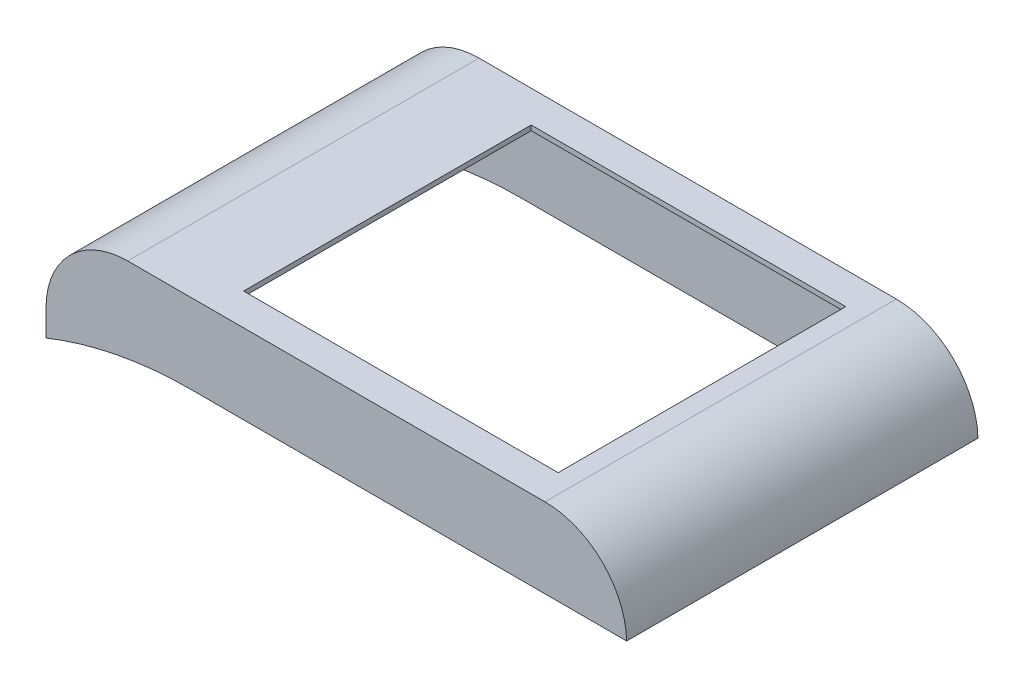
ISO-10303-21;
HEADER;
FILE_DESCRIPTION(('STEP AP214'),'2;1');
FILE_NAME('part.step','',(''),(''),'','','');
FILE_SCHEMA(('AUTOMOTIVE_DESIGN { 1 0 10303 214 1 1 1 1 }'));
ENDSEC;
DATA;
#1=APPLICATION_CONTEXT('core data for automotive mechanical design processes');
#2=APPLICATION_PROTOCOL_DEFINITION('international standard','automotive_design',2000,#1);
#3=PRODUCT_CONTEXT('',#1,'mechanical');
#4=PRODUCT('Part','Part','',(#3));
#5=PRODUCT_RELATED_PRODUCT_CATEGORY('part','',(#4));
#6=PRODUCT_DEFINITION_FORMATION('','',#4);
#7=PRODUCT_DEFINITION_CONTEXT('part definition',#1,'design');
#8=PRODUCT_DEFINITION('design','',#6,#7);
#9=PRODUCT_DEFINITION_SHAPE('','',#8);
#10=(LENGTH_UNIT() NAMED_UNIT(*) SI_UNIT(.MILLI.,.METRE.));
#11=(NAMED_UNIT(*) PLANE_ANGLE_UNIT() SI_UNIT($,.RADIAN.));
#12=(NAMED_UNIT(*) SI_UNIT($,.STERADIAN.) SOLID_ANGLE_UNIT());
#13=UNCERTAINTY_MEASURE_WITH_UNIT(LENGTH_MEASURE(1.E-05),#10,'distance_accuracy_value','');
#14=(GEOMETRIC_REPRESENTATION_CONTEXT(3) GLOBAL_UNCERTAINTY_ASSIGNED_CONTEXT((#13)) GLOBAL_UNIT_ASSIGNED_CONTEXT((#10,
#11,#12)) REPRESENTATION_CONTEXT('',''));
#15=CARTESIAN_POINT('',(0.,0.,0.));
#16=DIRECTION('',(0.,0.,1.));
#17=DIRECTION('',(1.,0.,0.));
#18=AXIS2_PLACEMENT_3D('',#15,#16,#17);
#19=CARTESIAN_POINT('',(18.57473769217,-76.2184026334848,-19.));
#20=DIRECTION('',(0.,0.,-1.));
#21=DIRECTION('',(-1.,0.,0.));
#22=AXIS2_PLACEMENT_3D('',#19,#20,#21);
#23=PLANE('',#22);
#24=DIRECTION('',(-1.,0.,0.));
#25=VECTOR('',#24,1.);
#26=CARTESIAN_POINT('',(18.57473769217,0.,-19.));
#27=LINE('',#26,#25);
#28=CARTESIAN_POINT('',(3.57473769217,0.,-19.));
#29=VERTEX_POINT('',#28);
#30=CARTESIAN_POINT('',(-32.2823525408233,0.,-19.));
#31=VERTEX_POINT('',#30);
#32=EDGE_CURVE('E284',#29,#31,#27,.T.);
#33=ORIENTED_EDGE('',*,*,#32,.F.);
#34=DIRECTION('',(0.,-1.,0.));
#35=VECTOR('',#34,1.);
#36=CARTESIAN_POINT('',(3.57473769217,3.,-19.));
#37=LINE('',#36,#35);
#38=CARTESIAN_POINT('',(3.57473769217,3.,-19.));
#39=VERTEX_POINT('',#38);
#40=EDGE_CURVE('E192',#39,#29,#37,.T.);
#41=ORIENTED_EDGE('',*,*,#40,.F.);
#42=DIRECTION('',(1.,0.,0.));
#43=VECTOR('',#42,1.);
#44=CARTESIAN_POINT('',(18.57473769217,3.,-19.));
#45=LINE('',#44,#43);
#46=CARTESIAN_POINT('',(18.4229126315243,3.,-19.));
#47=VERTEX_POINT('',#46);
#48=EDGE_CURVE('E193',#39,#47,#45,.T.);
#49=ORIENTED_EDGE('',*,*,#48,.T.);
#50=CARTESIAN_POINT('',(11.57473769217,1.55,-19.));
#51=DIRECTION('',(0.,0.,-1.));
#52=DIRECTION('',(-1.,0.,0.));
#53=AXIS2_PLACEMENT_3D('',#50,#51,#52);
#54=CIRCLE('',#53,7.);
#55=CARTESIAN_POINT('',(11.57473769217,8.55,-19.));
#56=VERTEX_POINT('',#55);
#57=EDGE_CURVE('E336',#47,#56,#54,.F.);
#58=ORIENTED_EDGE('',*,*,#57,.T.);
#59=DIRECTION('',(-1.,0.,0.));
#60=VECTOR('',#59,1.);
#61=CARTESIAN_POINT('',(18.57473769217,8.55,-19.));
#62=LINE('',#61,#60);
#63=CARTESIAN_POINT('',(-40.49526230783,8.55,-19.));
#64=VERTEX_POINT('',#63);
#65=EDGE_CURVE('E275',#56,#64,#62,.T.);
#66=ORIENTED_EDGE('',*,*,#65,.T.);
#67=CARTESIAN_POINT('',(-40.49526230783,1.55,-19.));
#68=DIRECTION('',(0.,0.,-1.));
#69=DIRECTION('',(-1.,0.,0.));
#70=AXIS2_PLACEMENT_3D('',#67,#68,#69);
#71=CIRCLE('',#70,7.);
#72=CARTESIAN_POINT('',(-47.49526230783,1.54999999999997,-19.));
#73=VERTEX_POINT('',#72);
#74=EDGE_CURVE('E338',#64,#73,#71,.F.);
#75=ORIENTED_EDGE('',*,*,#74,.T.);
#76=DIRECTION('',(0.,1.,0.));
#77=VECTOR('',#76,1.);
#78=CARTESIAN_POINT('',(-47.49526230783,-76.2184026334848,-19.));
#79=LINE('',#78,#77);
#80=CARTESIAN_POINT('',(-47.49526230783,-2.49640650628476,-19.));
#81=VERTEX_POINT('',#80);
#82=EDGE_CURVE('E288',#81,#73,#79,.T.);
#83=ORIENTED_EDGE('',*,*,#82,.F.);
#84=CARTESIAN_POINT('',(-32.2823525408233,-47.60135587401,-19.));
#85=DIRECTION('',(0.,0.,-1.));
#86=DIRECTION('',(-1.,0.,0.));
#87=AXIS2_PLACEMENT_3D('',#84,#85,#86);
#88=CIRCLE('',#87,47.60135587401);
#89=EDGE_CURVE('E212',#81,#31,#88,.T.);
#90=ORIENTED_EDGE('',*,*,#89,.T.);
#91=EDGE_LOOP('',(#33,#41,#49,#58,#66,#75,#83,#90));
#92=FACE_BOUND('',#91,.T.);
#93=ADVANCED_FACE('F35',(#92),#23,.F.);
#94=CARTESIAN_POINT('',(-47.49526230783,-76.2184026334848,19.));
#95=DIRECTION('',(0.,0.,1.));
#96=DIRECTION('',(1.,0.,0.));
#97=AXIS2_PLACEMENT_3D('',#94,#95,#96);
#98=PLANE('',#97);
#99=DIRECTION('',(-1.,0.,0.));
#100=VECTOR('',#99,1.);
#101=CARTESIAN_POINT('',(18.57473769217,3.,19.));
#102=LINE('',#101,#100);
#103=CARTESIAN_POINT('',(18.4229126315243,3.,19.));
#104=VERTEX_POINT('',#103);
#105=CARTESIAN_POINT('',(3.57473769217,3.,19.));
#106=VERTEX_POINT('',#105);
#107=EDGE_CURVE('E50',#104,#106,#102,.T.);
#108=ORIENTED_EDGE('',*,*,#107,.T.);
#109=DIRECTION('',(0.,-1.,0.));
#110=VECTOR('',#109,1.);
#111=CARTESIAN_POINT('',(3.57473769217,3.,19.));
#112=LINE('',#111,#110);
#113=CARTESIAN_POINT('',(3.57473769217,0.,19.));
#114=VERTEX_POINT('',#113);
#115=EDGE_CURVE('E183',#106,#114,#112,.T.);
#116=ORIENTED_EDGE('',*,*,#115,.T.);
#117=DIRECTION('',(1.,0.,0.));
#118=VECTOR('',#117,1.);
#119=CARTESIAN_POINT('',(-47.49526230783,0.,19.));
#120=LINE('',#119,#118);
#121=CARTESIAN_POINT('',(-32.2823525408233,0.,19.));
#122=VERTEX_POINT('',#121);
#123=EDGE_CURVE('E289',#122,#114,#120,.T.);
#124=ORIENTED_EDGE('',*,*,#123,.F.);
#125=CARTESIAN_POINT('',(-32.2823525408233,-47.60135587401,19.));
#126=DIRECTION('',(0.,0.,1.));
#127=DIRECTION('',(1.,0.,0.));
#128=AXIS2_PLACEMENT_3D('',#125,#126,#127);
#129=CIRCLE('',#128,47.60135587401);
#130=CARTESIAN_POINT('',(-47.49526230783,-2.49640650628476,19.));
#131=VERTEX_POINT('',#130);
#132=EDGE_CURVE('E215',#122,#131,#129,.T.);
#133=ORIENTED_EDGE('',*,*,#132,.T.);
#134=DIRECTION('',(0.,1.,0.));
#135=VECTOR('',#134,1.);
#136=CARTESIAN_POINT('',(-47.49526230783,-76.2184026334848,19.));
#137=LINE('',#136,#135);
#138=CARTESIAN_POINT('',(-47.49526230783,1.54999999999997,19.));
#139=VERTEX_POINT('',#138);
#140=EDGE_CURVE('E292',#131,#139,#137,.T.);
#141=ORIENTED_EDGE('',*,*,#140,.T.);
#142=CARTESIAN_POINT('',(-40.49526230783,1.55,19.));
#143=DIRECTION('',(0.,0.,1.));
#144=DIRECTION('',(1.,0.,0.));
#145=AXIS2_PLACEMENT_3D('',#142,#143,#144);
#146=CIRCLE('',#145,7.);
#147=CARTESIAN_POINT('',(-40.49526230783,8.55,19.));
#148=VERTEX_POINT('',#147);
#149=EDGE_CURVE('E330',#139,#148,#146,.F.);
#150=ORIENTED_EDGE('',*,*,#149,.T.);
#151=DIRECTION('',(1.,0.,0.));
#152=VECTOR('',#151,1.);
#153=CARTESIAN_POINT('',(-47.49526230783,8.55,19.));
#154=LINE('',#153,#152);
#155=CARTESIAN_POINT('',(11.57473769217,8.55,19.));
#156=VERTEX_POINT('',#155);
#157=EDGE_CURVE('E282',#148,#156,#154,.T.);
#158=ORIENTED_EDGE('',*,*,#157,.T.);
#159=CARTESIAN_POINT('',(11.57473769217,1.55,19.));
#160=DIRECTION('',(0.,0.,1.));
#161=DIRECTION('',(1.,0.,0.));
#162=AXIS2_PLACEMENT_3D('',#159,#160,#161);
#163=CIRCLE('',#162,7.);
#164=EDGE_CURVE('E203',#156,#104,#163,.F.);
#165=ORIENTED_EDGE('',*,*,#164,.T.);
#166=EDGE_LOOP('',(#108,#116,#124,#133,#141,#150,#158,#165));
#167=FACE_BOUND('',#166,.T.);
#168=ADVANCED_FACE('F200',(#167),#98,.F.);
#169=CARTESIAN_POINT('',(-32.2823525408233,0.,-21.5));
#170=DIRECTION('',(0.,-1.,0.));
#171=DIRECTION('',(1.,0.,0.));
#172=AXIS2_PLACEMENT_3D('',#169,#170,#171);
#173=PLANE('',#172);
#174=DIRECTION('',(0.,0.,-1.));
#175=VECTOR('',#174,1.);
#176=CARTESIAN_POINT('',(3.57473769217,0.,19.));
#177=LINE('',#176,#175);
#178=EDGE_CURVE('E188',#114,#29,#177,.T.);
#179=ORIENTED_EDGE('',*,*,#178,.T.);
#180=ORIENTED_EDGE('',*,*,#32,.T.);
#181=DIRECTION('',(0.,0.,1.));
#182=VECTOR('',#181,1.);
#183=CARTESIAN_POINT('',(-32.2823525408233,0.,-21.5));
#184=LINE('',#183,#182);
#185=CARTESIAN_POINT('',(-32.2823525408233,0.,-21.5));
#186=VERTEX_POINT('',#185);
#187=EDGE_CURVE('E317',#186,#31,#184,.T.);
#188=ORIENTED_EDGE('',*,*,#187,.F.);
#189=DIRECTION('',(1.,0.,0.));
#190=VECTOR('',#189,1.);
#191=CARTESIAN_POINT('',(-32.2823525408233,0.,-21.5));
#192=LINE('',#191,#190);
#193=CARTESIAN_POINT('',(21.0747376921568,0.,-21.5));
#194=VERTEX_POINT('',#193);
#195=EDGE_CURVE('E295',#186,#194,#192,.T.);
#196=ORIENTED_EDGE('',*,*,#195,.T.);
#197=DIRECTION('',(0.,0.,1.));
#198=VECTOR('',#197,1.);
#199=CARTESIAN_POINT('',(21.0747376921568,0.,-21.5));
#200=LINE('',#199,#198);
#201=CARTESIAN_POINT('',(21.0747376921568,0.,21.5));
#202=VERTEX_POINT('',#201);
#203=EDGE_CURVE('E307',#194,#202,#200,.T.);
#204=ORIENTED_EDGE('',*,*,#203,.T.);
#205=DIRECTION('',(1.,0.,0.));
#206=VECTOR('',#205,1.);
#207=CARTESIAN_POINT('',(-32.2823525408233,0.,21.5));
#208=LINE('',#207,#206);
#209=CARTESIAN_POINT('',(-32.2823525408233,0.,21.5));
#210=VERTEX_POINT('',#209);
#211=EDGE_CURVE('E291',#210,#202,#208,.T.);
#212=ORIENTED_EDGE('',*,*,#211,.F.);
#213=EDGE_CURVE('E321',#122,#210,#184,.T.);
#214=ORIENTED_EDGE('',*,*,#213,.F.);
#215=ORIENTED_EDGE('',*,*,#123,.T.);
#216=EDGE_LOOP('',(#179,#180,#188,#196,#204,#212,#214,#215));
#217=FACE_BOUND('',#216,.T.);
#218=ADVANCED_FACE('F363',(#217),#173,.T.);
#219=CARTESIAN_POINT('',(-32.2823525408233,-47.60135587401,-21.5));
#220=DIRECTION('',(0.,0.,1.));
#221=DIRECTION('',(1.,0.,0.));
#222=AXIS2_PLACEMENT_3D('',#219,#220,#221);
#223=CYLINDRICAL_SURFACE('',#222,47.60135587401);
#224=ORIENTED_EDGE('',*,*,#89,.F.);
#225=DIRECTION('',(0.,0.,1.));
#226=VECTOR('',#225,1.);
#227=CARTESIAN_POINT('',(-47.49526230783,-2.49640650628476,-21.5));
#228=LINE('',#227,#226);
#229=EDGE_CURVE('E208',#81,#131,#228,.T.);
#230=ORIENTED_EDGE('',*,*,#229,.T.);
#231=ORIENTED_EDGE('',*,*,#132,.F.);
#232=ORIENTED_EDGE('',*,*,#213,.T.);
#233=CARTESIAN_POINT('',(-32.2823525408233,-47.60135587401,21.5));
#234=DIRECTION('',(0.,0.,-1.));
#235=DIRECTION('',(-1.,0.,0.));
#236=AXIS2_PLACEMENT_3D('',#233,#234,#235);
#237=CIRCLE('',#236,47.60135587401);
#238=CARTESIAN_POINT('',(-49.99526230783,-3.418305858987,21.5));
#239=VERTEX_POINT('',#238);
#240=EDGE_CURVE('E299',#239,#210,#237,.T.);
#241=ORIENTED_EDGE('',*,*,#240,.F.);
#242=DIRECTION('',(0.,0.,1.));
#243=VECTOR('',#242,1.);
#244=CARTESIAN_POINT('',(-49.99526230783,-3.418305858987,-21.5));
#245=LINE('',#244,#243);
#246=CARTESIAN_POINT('',(-49.99526230783,-3.418305858987,-21.5));
#247=VERTEX_POINT('',#246);
#248=EDGE_CURVE('E322',#247,#239,#245,.T.);
#249=ORIENTED_EDGE('',*,*,#248,.F.);
#250=CARTESIAN_POINT('',(-32.2823525408233,-47.60135587401,-21.5));
#251=DIRECTION('',(0.,0.,-1.));
#252=DIRECTION('',(-1.,0.,0.));
#253=AXIS2_PLACEMENT_3D('',#250,#251,#252);
#254=CIRCLE('',#253,47.60135587401);
#255=EDGE_CURVE('E304',#247,#186,#254,.T.);
#256=ORIENTED_EDGE('',*,*,#255,.T.);
#257=ORIENTED_EDGE('',*,*,#187,.T.);
#258=EDGE_LOOP('',(#224,#230,#231,#232,#241,#249,#256,#257));
#259=FACE_BOUND('',#258,.T.);
#260=ADVANCED_FACE('F378',(#259),#223,.F.);
#261=CARTESIAN_POINT('',(-49.99526230783,9.75,-21.5));
#262=DIRECTION('',(-1.,0.,0.));
#263=DIRECTION('',(0.,-1.,0.));
#264=AXIS2_PLACEMENT_3D('',#261,#262,#263);
#265=PLANE('',#264);
#266=DIRECTION('',(0.,-1.,0.));
#267=VECTOR('',#266,1.);
#268=CARTESIAN_POINT('',(-49.99526230783,9.75,21.5));
#269=LINE('',#268,#267);
#270=CARTESIAN_POINT('',(-49.99526230783,-0.249999999999992,21.5));
#271=VERTEX_POINT('',#270);
#272=EDGE_CURVE('E313',#271,#239,#269,.T.);
#273=ORIENTED_EDGE('',*,*,#272,.F.);
#274=DIRECTION('',(0.,0.,1.));
#275=VECTOR('',#274,1.);
#276=CARTESIAN_POINT('',(-49.99526230783,-0.249999999999992,-21.5));
#277=LINE('',#276,#275);
#278=CARTESIAN_POINT('',(-49.99526230783,-0.249999999999992,-21.5));
#279=VERTEX_POINT('',#278);
#280=EDGE_CURVE('E43',#271,#279,#277,.F.);
#281=ORIENTED_EDGE('',*,*,#280,.T.);
#282=DIRECTION('',(0.,-1.,0.));
#283=VECTOR('',#282,1.);
#284=CARTESIAN_POINT('',(-49.99526230783,9.75,-21.5));
#285=LINE('',#284,#283);
#286=EDGE_CURVE('E302',#279,#247,#285,.T.);
#287=ORIENTED_EDGE('',*,*,#286,.T.);
#288=ORIENTED_EDGE('',*,*,#248,.T.);
#289=EDGE_LOOP('',(#273,#281,#287,#288));
#290=FACE_BOUND('',#289,.T.);
#291=ADVANCED_FACE('F374',(#290),#265,.T.);
#292=CARTESIAN_POINT('',(21.0747376921568,9.75000000000001,-21.5));
#293=DIRECTION('',(0.,1.,0.));
#294=DIRECTION('',(-1.,0.,0.));
#295=AXIS2_PLACEMENT_3D('',#292,#293,#294);
#296=PLANE('',#295);
#297=DIRECTION('',(0.,0.,-1.));
#298=VECTOR('',#297,1.);
#299=CARTESIAN_POINT('',(8.78973769216338,9.75000000000001,17.6));
#300=LINE('',#299,#298);
#301=CARTESIAN_POINT('',(8.78973769216338,9.75000000000001,17.6));
#302=VERTEX_POINT('',#301);
#303=CARTESIAN_POINT('',(8.78973769216341,9.75000000000001,-17.6));
#304=VERTEX_POINT('',#303);
#305=EDGE_CURVE('E226',#302,#304,#300,.T.);
#306=ORIENTED_EDGE('',*,*,#305,.F.);
#307=DIRECTION('',(1.,0.,0.));
#308=VECTOR('',#307,1.);
#309=CARTESIAN_POINT('',(-29.7102623078366,9.75000000000001,17.6));
#310=LINE('',#309,#308);
#311=CARTESIAN_POINT('',(-29.7102623078366,9.75000000000001,17.6));
#312=VERTEX_POINT('',#311);
#313=EDGE_CURVE('E234',#312,#302,#310,.T.);
#314=ORIENTED_EDGE('',*,*,#313,.F.);
#315=DIRECTION('',(0.,0.,1.));
#316=VECTOR('',#315,1.);
#317=CARTESIAN_POINT('',(-29.7102623078366,9.75000000000001,-17.6));
#318=LINE('',#317,#316);
#319=CARTESIAN_POINT('',(-29.7102623078366,9.75000000000001,-17.6));
#320=VERTEX_POINT('',#319);
#321=EDGE_CURVE('E231',#320,#312,#318,.T.);
#322=ORIENTED_EDGE('',*,*,#321,.F.);
#323=DIRECTION('',(-1.,0.,0.));
#324=VECTOR('',#323,1.);
#325=CARTESIAN_POINT('',(8.78973769216341,9.75000000000001,-17.6));
#326=LINE('',#325,#324);
#327=EDGE_CURVE('E228',#304,#320,#326,.T.);
#328=ORIENTED_EDGE('',*,*,#327,.F.);
#329=EDGE_LOOP('',(#306,#314,#322,#328));
#330=FACE_BOUND('',#329,.T.);
#331=DIRECTION('',(-1.,0.,0.));
#332=VECTOR('',#331,1.);
#333=CARTESIAN_POINT('',(21.0747376921568,9.75000000000001,21.5));
#334=LINE('',#333,#332);
#335=CARTESIAN_POINT('',(11.0778631805906,9.75000000000001,21.5));
#336=VERTEX_POINT('',#335);
#337=CARTESIAN_POINT('',(-39.99526230783,9.75000000000001,21.5));
#338=VERTEX_POINT('',#337);
#339=EDGE_CURVE('E310',#336,#338,#334,.T.);
#340=ORIENTED_EDGE('',*,*,#339,.F.);
#341=DIRECTION('',(0.,0.,1.));
#342=VECTOR('',#341,1.);
#343=CARTESIAN_POINT('',(11.0778631805906,9.75000000000001,-21.5));
#344=LINE('',#343,#342);
#345=CARTESIAN_POINT('',(11.0778631805906,9.75000000000001,-21.5));
#346=VERTEX_POINT('',#345);
#347=EDGE_CURVE('E348',#336,#346,#344,.F.);
#348=ORIENTED_EDGE('',*,*,#347,.T.);
#349=DIRECTION('',(-1.,0.,0.));
#350=VECTOR('',#349,1.);
#351=CARTESIAN_POINT('',(21.0747376921568,9.75000000000001,-21.5));
#352=LINE('',#351,#350);
#353=CARTESIAN_POINT('',(-39.99526230783,9.75000000000001,-21.5));
#354=VERTEX_POINT('',#353);
#355=EDGE_CURVE('E298',#346,#354,#352,.T.);
#356=ORIENTED_EDGE('',*,*,#355,.T.);
#357=DIRECTION('',(0.,0.,1.));
#358=VECTOR('',#357,1.);
#359=CARTESIAN_POINT('',(-39.99526230783,9.75000000000001,-21.5));
#360=LINE('',#359,#358);
#361=EDGE_CURVE('E345',#354,#338,#360,.T.);
#362=ORIENTED_EDGE('',*,*,#361,.T.);
#363=EDGE_LOOP('',(#340,#348,#356,#362));
#364=FACE_BOUND('',#363,.T.);
#365=ADVANCED_FACE('F370',(#330,#364),#296,.T.);
#366=CARTESIAN_POINT('',(-32.2823525408233,-47.60135587401,-21.5));
#367=DIRECTION('',(0.,0.,-1.));
#368=DIRECTION('',(-1.,0.,0.));
#369=AXIS2_PLACEMENT_3D('',#366,#367,#368);
#370=PLANE('',#369);
#371=ORIENTED_EDGE('',*,*,#355,.F.);
#372=CARTESIAN_POINT('',(11.0778631805907,-0.24999999999999,-21.5));
#373=DIRECTION('',(0.,0.,-1.));
#374=DIRECTION('',(-1.,0.,0.));
#375=AXIS2_PLACEMENT_3D('',#372,#373,#374);
#376=CIRCLE('',#375,10.);
#377=EDGE_CURVE('E352',#346,#194,#376,.T.);
#378=ORIENTED_EDGE('',*,*,#377,.T.);
#379=ORIENTED_EDGE('',*,*,#195,.F.);
#380=ORIENTED_EDGE('',*,*,#255,.F.);
#381=ORIENTED_EDGE('',*,*,#286,.F.);
#382=CARTESIAN_POINT('',(-39.99526230783,-0.249999999999997,-21.5));
#383=DIRECTION('',(0.,0.,-1.));
#384=DIRECTION('',(-1.,0.,0.));
#385=AXIS2_PLACEMENT_3D('',#382,#383,#384);
#386=CIRCLE('',#385,10.);
#387=EDGE_CURVE('E350',#279,#354,#386,.T.);
#388=ORIENTED_EDGE('',*,*,#387,.T.);
#389=EDGE_LOOP('',(#371,#378,#379,#380,#381,#388));
#390=FACE_BOUND('',#389,.T.);
#391=ADVANCED_FACE('F357',(#390),#370,.T.);
#392=CARTESIAN_POINT('',(-32.2823525408233,-47.60135587401,21.5));
#393=DIRECTION('',(0.,0.,-1.));
#394=DIRECTION('',(-1.,0.,0.));
#395=AXIS2_PLACEMENT_3D('',#392,#393,#394);
#396=PLANE('',#395);
#397=ORIENTED_EDGE('',*,*,#211,.T.);
#398=CARTESIAN_POINT('',(11.0778631805907,-0.24999999999999,21.5));
#399=DIRECTION('',(0.,0.,-1.));
#400=DIRECTION('',(-1.,0.,0.));
#401=AXIS2_PLACEMENT_3D('',#398,#399,#400);
#402=CIRCLE('',#401,10.);
#403=EDGE_CURVE('E343',#202,#336,#402,.F.);
#404=ORIENTED_EDGE('',*,*,#403,.T.);
#405=ORIENTED_EDGE('',*,*,#339,.T.);
#406=CARTESIAN_POINT('',(-39.99526230783,-0.249999999999997,21.5));
#407=DIRECTION('',(0.,0.,-1.));
#408=DIRECTION('',(-1.,0.,0.));
#409=AXIS2_PLACEMENT_3D('',#406,#407,#408);
#410=CIRCLE('',#409,10.);
#411=EDGE_CURVE('E341',#338,#271,#410,.F.);
#412=ORIENTED_EDGE('',*,*,#411,.T.);
#413=ORIENTED_EDGE('',*,*,#272,.T.);
#414=ORIENTED_EDGE('',*,*,#240,.T.);
#415=EDGE_LOOP('',(#397,#404,#405,#412,#413,#414));
#416=FACE_BOUND('',#415,.T.);
#417=ADVANCED_FACE('F368',(#416),#396,.F.);
#418=CARTESIAN_POINT('',(0.,8.55,0.));
#419=DIRECTION('',(0.,1.,0.));
#420=DIRECTION('',(0.,0.,1.));
#421=AXIS2_PLACEMENT_3D('',#418,#419,#420);
#422=PLANE('',#421);
#423=DIRECTION('',(1.,0.,0.));
#424=VECTOR('',#423,1.);
#425=CARTESIAN_POINT('',(-38.2102623078366,8.55,-18.5));
#426=LINE('',#425,#424);
#427=CARTESIAN_POINT('',(-38.2102623078366,8.55,-18.5));
#428=VERTEX_POINT('',#427);
#429=CARTESIAN_POINT('',(9.28973769216337,8.55,-18.5));
#430=VERTEX_POINT('',#429);
#431=EDGE_CURVE('E265',#428,#430,#426,.T.);
#432=ORIENTED_EDGE('',*,*,#431,.F.);
#433=DIRECTION('',(0.,0.,-1.));
#434=VECTOR('',#433,1.);
#435=CARTESIAN_POINT('',(-38.2102623078366,8.55,18.5));
#436=LINE('',#435,#434);
#437=CARTESIAN_POINT('',(-38.2102623078366,8.55,18.5));
#438=VERTEX_POINT('',#437);
#439=EDGE_CURVE('E249',#438,#428,#436,.T.);
#440=ORIENTED_EDGE('',*,*,#439,.F.);
#441=DIRECTION('',(-1.,0.,0.));
#442=VECTOR('',#441,1.);
#443=CARTESIAN_POINT('',(9.28973769216338,8.55,18.5));
#444=LINE('',#443,#442);
#445=CARTESIAN_POINT('',(9.28973769216338,8.55,18.5));
#446=VERTEX_POINT('',#445);
#447=EDGE_CURVE('E254',#446,#438,#444,.T.);
#448=ORIENTED_EDGE('',*,*,#447,.F.);
#449=DIRECTION('',(0.,0.,1.));
#450=VECTOR('',#449,1.);
#451=CARTESIAN_POINT('',(9.28973769216337,8.55,-18.5));
#452=LINE('',#451,#450);
#453=EDGE_CURVE('E268',#430,#446,#452,.T.);
#454=ORIENTED_EDGE('',*,*,#453,.F.);
#455=EDGE_LOOP('',(#432,#440,#448,#454));
#456=FACE_BOUND('',#455,.T.);
#457=ORIENTED_EDGE('',*,*,#157,.F.);
#458=DIRECTION('',(0.,0.,1.));
#459=VECTOR('',#458,1.);
#460=CARTESIAN_POINT('',(-40.49526230783,8.55,-19.));
#461=LINE('',#460,#459);
#462=EDGE_CURVE('E334',#148,#64,#461,.F.);
#463=ORIENTED_EDGE('',*,*,#462,.T.);
#464=ORIENTED_EDGE('',*,*,#65,.F.);
#465=DIRECTION('',(0.,0.,-1.));
#466=VECTOR('',#465,1.);
#467=CARTESIAN_POINT('',(11.57473769217,8.55,19.));
#468=LINE('',#467,#466);
#469=EDGE_CURVE('E332',#56,#156,#468,.F.);
#470=ORIENTED_EDGE('',*,*,#469,.T.);
#471=EDGE_LOOP('',(#457,#463,#464,#470));
#472=FACE_BOUND('',#471,.T.);
#473=ADVANCED_FACE('F396',(#456,#472),#422,.F.);
#474=CARTESIAN_POINT('',(-47.49526230783,-76.2184026334848,-19.));
#475=DIRECTION('',(-1.,0.,0.));
#476=DIRECTION('',(0.,0.,1.));
#477=AXIS2_PLACEMENT_3D('',#474,#475,#476);
#478=PLANE('',#477);
#479=ORIENTED_EDGE('',*,*,#140,.F.);
#480=ORIENTED_EDGE('',*,*,#229,.F.);
#481=ORIENTED_EDGE('',*,*,#82,.T.);
#482=DIRECTION('',(0.,0.,1.));
#483=VECTOR('',#482,1.);
#484=CARTESIAN_POINT('',(-47.49526230783,1.55,19.));
#485=LINE('',#484,#483);
#486=EDGE_CURVE('E320',#73,#139,#485,.T.);
#487=ORIENTED_EDGE('',*,*,#486,.T.);
#488=EDGE_LOOP('',(#479,#480,#481,#487));
#489=FACE_BOUND('',#488,.T.);
#490=ADVANCED_FACE('F385',(#489),#478,.F.);
#491=CARTESIAN_POINT('',(-38.2102623078366,9.15,18.5));
#492=DIRECTION('',(-1.,0.,0.));
#493=DIRECTION('',(0.,0.,1.));
#494=AXIS2_PLACEMENT_3D('',#491,#492,#493);
#495=PLANE('',#494);
#496=ORIENTED_EDGE('',*,*,#439,.T.);
#497=DIRECTION('',(0.,-1.,0.));
#498=VECTOR('',#497,1.);
#499=CARTESIAN_POINT('',(-38.2102623078366,9.15,-18.5));
#500=LINE('',#499,#498);
#501=CARTESIAN_POINT('',(-38.2102623078366,9.15,-18.5));
#502=VERTEX_POINT('',#501);
#503=EDGE_CURVE('E263',#502,#428,#500,.T.);
#504=ORIENTED_EDGE('',*,*,#503,.F.);
#505=DIRECTION('',(0.,0.,-1.));
#506=VECTOR('',#505,1.);
#507=CARTESIAN_POINT('',(-38.2102623078366,9.15,18.5));
#508=LINE('',#507,#506);
#509=CARTESIAN_POINT('',(-38.2102623078366,9.15,18.5));
#510=VERTEX_POINT('',#509);
#511=EDGE_CURVE('E250',#510,#502,#508,.T.);
#512=ORIENTED_EDGE('',*,*,#511,.F.);
#513=DIRECTION('',(0.,-1.,0.));
#514=VECTOR('',#513,1.);
#515=CARTESIAN_POINT('',(-38.2102623078366,9.15,18.5));
#516=LINE('',#515,#514);
#517=EDGE_CURVE('E273',#510,#438,#516,.T.);
#518=ORIENTED_EDGE('',*,*,#517,.T.);
#519=EDGE_LOOP('',(#496,#504,#512,#518));
#520=FACE_BOUND('',#519,.T.);
#521=ADVANCED_FACE('F441',(#520),#495,.F.);
#522=CARTESIAN_POINT('',(9.28973769216338,9.15,18.5));
#523=DIRECTION('',(0.,0.,1.));
#524=DIRECTION('',(1.,0.,0.));
#525=AXIS2_PLACEMENT_3D('',#522,#523,#524);
#526=PLANE('',#525);
#527=ORIENTED_EDGE('',*,*,#447,.T.);
#528=ORIENTED_EDGE('',*,*,#517,.F.);
#529=DIRECTION('',(-1.,0.,0.));
#530=VECTOR('',#529,1.);
#531=CARTESIAN_POINT('',(9.28973769216338,9.15,18.5));
#532=LINE('',#531,#530);
#533=CARTESIAN_POINT('',(9.28973769216338,9.15,18.5));
#534=VERTEX_POINT('',#533);
#535=EDGE_CURVE('E260',#534,#510,#532,.T.);
#536=ORIENTED_EDGE('',*,*,#535,.F.);
#537=DIRECTION('',(0.,-1.,0.));
#538=VECTOR('',#537,1.);
#539=CARTESIAN_POINT('',(9.28973769216338,9.15,18.5));
#540=LINE('',#539,#538);
#541=EDGE_CURVE('E276',#534,#446,#540,.T.);
#542=ORIENTED_EDGE('',*,*,#541,.T.);
#543=EDGE_LOOP('',(#527,#528,#536,#542));
#544=FACE_BOUND('',#543,.T.);
#545=ADVANCED_FACE('F573',(#544),#526,.F.);
#546=CARTESIAN_POINT('',(9.28973769216337,9.15,-18.5));
#547=DIRECTION('',(1.,0.,0.));
#548=DIRECTION('',(0.,0.,-1.));
#549=AXIS2_PLACEMENT_3D('',#546,#547,#548);
#550=PLANE('',#549);
#551=ORIENTED_EDGE('',*,*,#453,.T.);
#552=ORIENTED_EDGE('',*,*,#541,.F.);
#553=DIRECTION('',(0.,0.,1.));
#554=VECTOR('',#553,1.);
#555=CARTESIAN_POINT('',(9.28973769216337,9.15,-18.5));
#556=LINE('',#555,#554);
#557=CARTESIAN_POINT('',(9.28973769216337,9.15,-18.5));
#558=VERTEX_POINT('',#557);
#559=EDGE_CURVE('E257',#558,#534,#556,.T.);
#560=ORIENTED_EDGE('',*,*,#559,.F.);
#561=DIRECTION('',(0.,-1.,0.));
#562=VECTOR('',#561,1.);
#563=CARTESIAN_POINT('',(9.28973769216337,9.15,-18.5));
#564=LINE('',#563,#562);
#565=EDGE_CURVE('E278',#558,#430,#564,.T.);
#566=ORIENTED_EDGE('',*,*,#565,.T.);
#567=EDGE_LOOP('',(#551,#552,#560,#566));
#568=FACE_BOUND('',#567,.T.);
#569=ADVANCED_FACE('F564',(#568),#550,.F.);
#570=CARTESIAN_POINT('',(-38.2102623078366,9.15,-18.5));
#571=DIRECTION('',(0.,0.,-1.));
#572=DIRECTION('',(-1.,0.,0.));
#573=AXIS2_PLACEMENT_3D('',#570,#571,#572);
#574=PLANE('',#573);
#575=ORIENTED_EDGE('',*,*,#431,.T.);
#576=ORIENTED_EDGE('',*,*,#565,.F.);
#577=DIRECTION('',(1.,0.,0.));
#578=VECTOR('',#577,1.);
#579=CARTESIAN_POINT('',(-38.2102623078366,9.15,-18.5));
#580=LINE('',#579,#578);
#581=EDGE_CURVE('E253',#502,#558,#580,.T.);
#582=ORIENTED_EDGE('',*,*,#581,.F.);
#583=ORIENTED_EDGE('',*,*,#503,.T.);
#584=EDGE_LOOP('',(#575,#576,#582,#583));
#585=FACE_BOUND('',#584,.T.);
#586=ADVANCED_FACE('F555',(#585),#574,.F.);
#587=CARTESIAN_POINT('',(0.,9.15,0.));
#588=DIRECTION('',(0.,-1.,0.));
#589=DIRECTION('',(0.,0.,-1.));
#590=AXIS2_PLACEMENT_3D('',#587,#588,#589);
#591=PLANE('',#590);
#592=DIRECTION('',(0.,0.,-1.));
#593=VECTOR('',#592,1.);
#594=CARTESIAN_POINT('',(8.78973769216338,9.15,17.6));
#595=LINE('',#594,#593);
#596=CARTESIAN_POINT('',(8.78973769216338,9.15,17.6));
#597=VERTEX_POINT('',#596);
#598=CARTESIAN_POINT('',(8.78973769216341,9.15,-17.6));
#599=VERTEX_POINT('',#598);
#600=EDGE_CURVE('E223',#597,#599,#595,.T.);
#601=ORIENTED_EDGE('',*,*,#600,.T.);
#602=DIRECTION('',(-1.,0.,0.));
#603=VECTOR('',#602,1.);
#604=CARTESIAN_POINT('',(8.78973769216341,9.15,-17.6));
#605=LINE('',#604,#603);
#606=CARTESIAN_POINT('',(-29.7102623078366,9.15,-17.6));
#607=VERTEX_POINT('',#606);
#608=EDGE_CURVE('E240',#599,#607,#605,.T.);
#609=ORIENTED_EDGE('',*,*,#608,.T.);
#610=DIRECTION('',(0.,0.,1.));
#611=VECTOR('',#610,1.);
#612=CARTESIAN_POINT('',(-29.7102623078366,9.15,-17.6));
#613=LINE('',#612,#611);
#614=CARTESIAN_POINT('',(-29.7102623078366,9.15,17.6));
#615=VERTEX_POINT('',#614);
#616=EDGE_CURVE('E217',#607,#615,#613,.T.);
#617=ORIENTED_EDGE('',*,*,#616,.T.);
#618=DIRECTION('',(1.,0.,0.));
#619=VECTOR('',#618,1.);
#620=CARTESIAN_POINT('',(-29.7102623078366,9.15,17.6));
#621=LINE('',#620,#619);
#622=EDGE_CURVE('E220',#615,#597,#621,.T.);
#623=ORIENTED_EDGE('',*,*,#622,.T.);
#624=EDGE_LOOP('',(#601,#609,#617,#623));
#625=FACE_BOUND('',#624,.T.);
#626=ORIENTED_EDGE('',*,*,#511,.T.);
#627=ORIENTED_EDGE('',*,*,#581,.T.);
#628=ORIENTED_EDGE('',*,*,#559,.T.);
#629=ORIENTED_EDGE('',*,*,#535,.T.);
#630=EDGE_LOOP('',(#626,#627,#628,#629));
#631=FACE_BOUND('',#630,.T.);
#632=ADVANCED_FACE('F546',(#625,#631),#591,.T.);
#633=CARTESIAN_POINT('',(8.78973769216338,-3.419305858987,17.6));
#634=DIRECTION('',(1.,0.,0.));
#635=DIRECTION('',(0.,0.,-1.));
#636=AXIS2_PLACEMENT_3D('',#633,#634,#635);
#637=PLANE('',#636);
#638=DIRECTION('',(0.,1.,0.));
#639=VECTOR('',#638,1.);
#640=CARTESIAN_POINT('',(8.78973769216338,-3.419305858987,17.6));
#641=LINE('',#640,#639);
#642=EDGE_CURVE('E238',#597,#302,#641,.T.);
#643=ORIENTED_EDGE('',*,*,#642,.T.);
#644=ORIENTED_EDGE('',*,*,#305,.T.);
#645=DIRECTION('',(0.,1.,0.));
#646=VECTOR('',#645,1.);
#647=CARTESIAN_POINT('',(8.78973769216341,-3.419305858987,-17.6));
#648=LINE('',#647,#646);
#649=EDGE_CURVE('E237',#599,#304,#648,.T.);
#650=ORIENTED_EDGE('',*,*,#649,.F.);
#651=ORIENTED_EDGE('',*,*,#600,.F.);
#652=EDGE_LOOP('',(#643,#644,#650,#651));
#653=FACE_BOUND('',#652,.T.);
#654=ADVANCED_FACE('F537',(#653),#637,.F.);
#655=CARTESIAN_POINT('',(-29.7102623078366,-3.41930585898701,17.6));
#656=DIRECTION('',(0.,0.,1.));
#657=DIRECTION('',(1.,0.,0.));
#658=AXIS2_PLACEMENT_3D('',#655,#656,#657);
#659=PLANE('',#658);
#660=DIRECTION('',(0.,1.,0.));
#661=VECTOR('',#660,1.);
#662=CARTESIAN_POINT('',(-29.7102623078366,-3.41930585898701,17.6));
#663=LINE('',#662,#661);
#664=EDGE_CURVE('E241',#615,#312,#663,.T.);
#665=ORIENTED_EDGE('',*,*,#664,.T.);
#666=ORIENTED_EDGE('',*,*,#313,.T.);
#667=ORIENTED_EDGE('',*,*,#642,.F.);
#668=ORIENTED_EDGE('',*,*,#622,.F.);
#669=EDGE_LOOP('',(#665,#666,#667,#668));
#670=FACE_BOUND('',#669,.T.);
#671=ADVANCED_FACE('F528',(#670),#659,.F.);
#672=CARTESIAN_POINT('',(-29.7102623078366,-3.41930585898701,-17.6));
#673=DIRECTION('',(-1.,0.,0.));
#674=DIRECTION('',(0.,0.,1.));
#675=AXIS2_PLACEMENT_3D('',#672,#673,#674);
#676=PLANE('',#675);
#677=DIRECTION('',(0.,1.,0.));
#678=VECTOR('',#677,1.);
#679=CARTESIAN_POINT('',(-29.7102623078366,-3.41930585898701,-17.6));
#680=LINE('',#679,#678);
#681=EDGE_CURVE('E243',#607,#320,#680,.T.);
#682=ORIENTED_EDGE('',*,*,#681,.T.);
#683=ORIENTED_EDGE('',*,*,#321,.T.);
#684=ORIENTED_EDGE('',*,*,#664,.F.);
#685=ORIENTED_EDGE('',*,*,#616,.F.);
#686=EDGE_LOOP('',(#682,#683,#684,#685));
#687=FACE_BOUND('',#686,.T.);
#688=ADVANCED_FACE('F519',(#687),#676,.F.);
#689=CARTESIAN_POINT('',(8.78973769216341,-3.419305858987,-17.6));
#690=DIRECTION('',(0.,0.,-1.));
#691=DIRECTION('',(-1.,0.,0.));
#692=AXIS2_PLACEMENT_3D('',#689,#690,#691);
#693=PLANE('',#692);
#694=ORIENTED_EDGE('',*,*,#649,.T.);
#695=ORIENTED_EDGE('',*,*,#327,.T.);
#696=ORIENTED_EDGE('',*,*,#681,.F.);
#697=ORIENTED_EDGE('',*,*,#608,.F.);
#698=EDGE_LOOP('',(#694,#695,#696,#697));
#699=FACE_BOUND('',#698,.T.);
#700=ADVANCED_FACE('F409',(#699),#693,.F.);
#701=CARTESIAN_POINT('',(-40.49526230783,1.55,-19.));
#702=DIRECTION('',(0.,0.,-1.));
#703=DIRECTION('',(-1.,0.,0.));
#704=AXIS2_PLACEMENT_3D('',#701,#702,#703);
#705=CYLINDRICAL_SURFACE('',#704,7.);
#706=ORIENTED_EDGE('',*,*,#74,.F.);
#707=ORIENTED_EDGE('',*,*,#462,.F.);
#708=ORIENTED_EDGE('',*,*,#149,.F.);
#709=ORIENTED_EDGE('',*,*,#486,.F.);
#710=EDGE_LOOP('',(#706,#707,#708,#709));
#711=FACE_BOUND('',#710,.T.);
#712=ADVANCED_FACE('F393',(#711),#705,.F.);
#713=CARTESIAN_POINT('',(11.57473769217,1.55,19.));
#714=DIRECTION('',(0.,0.,1.));
#715=DIRECTION('',(1.,0.,0.));
#716=AXIS2_PLACEMENT_3D('',#713,#714,#715);
#717=CYLINDRICAL_SURFACE('',#716,7.);
#718=ORIENTED_EDGE('',*,*,#57,.F.);
#719=DIRECTION('',(0.,0.,1.));
#720=VECTOR('',#719,1.);
#721=CARTESIAN_POINT('',(18.4229126315243,3.,19.));
#722=LINE('',#721,#720);
#723=EDGE_CURVE('E11',#47,#104,#722,.T.);
#724=ORIENTED_EDGE('',*,*,#723,.T.);
#725=ORIENTED_EDGE('',*,*,#164,.F.);
#726=ORIENTED_EDGE('',*,*,#469,.F.);
#727=EDGE_LOOP('',(#718,#724,#725,#726));
#728=FACE_BOUND('',#727,.T.);
#729=ADVANCED_FACE('F400',(#728),#717,.F.);
#730=CARTESIAN_POINT('',(11.0778631805907,-0.24999999999999,-21.5));
#731=DIRECTION('',(0.,0.,-1.));
#732=DIRECTION('',(-1.,0.,0.));
#733=AXIS2_PLACEMENT_3D('',#730,#731,#732);
#734=CYLINDRICAL_SURFACE('',#733,10.);
#735=ORIENTED_EDGE('',*,*,#377,.F.);
#736=ORIENTED_EDGE('',*,*,#347,.F.);
#737=ORIENTED_EDGE('',*,*,#403,.F.);
#738=ORIENTED_EDGE('',*,*,#203,.F.);
#739=EDGE_LOOP('',(#735,#736,#737,#738));
#740=FACE_BOUND('',#739,.T.);
#741=ADVANCED_FACE('F365',(#740),#734,.T.);
#742=CARTESIAN_POINT('',(-39.99526230783,-0.249999999999997,-21.5));
#743=DIRECTION('',(0.,0.,1.));
#744=DIRECTION('',(1.,0.,0.));
#745=AXIS2_PLACEMENT_3D('',#742,#743,#744);
#746=CYLINDRICAL_SURFACE('',#745,10.);
#747=ORIENTED_EDGE('',*,*,#387,.F.);
#748=ORIENTED_EDGE('',*,*,#280,.F.);
#749=ORIENTED_EDGE('',*,*,#411,.F.);
#750=ORIENTED_EDGE('',*,*,#361,.F.);
#751=EDGE_LOOP('',(#747,#748,#749,#750));
#752=FACE_BOUND('',#751,.T.);
#753=ADVANCED_FACE('F37',(#752),#746,.T.);
#754=CARTESIAN_POINT('',(0.,3.,0.));
#755=DIRECTION('',(0.,1.,0.));
#756=DIRECTION('',(-1.,0.,0.));
#757=AXIS2_PLACEMENT_3D('',#754,#755,#756);
#758=PLANE('',#757);
#759=ORIENTED_EDGE('',*,*,#723,.F.);
#760=ORIENTED_EDGE('',*,*,#48,.F.);
#761=DIRECTION('',(0.,0.,-1.));
#762=VECTOR('',#761,1.);
#763=CARTESIAN_POINT('',(3.57473769217,3.,19.));
#764=LINE('',#763,#762);
#765=EDGE_CURVE('E185',#106,#39,#764,.T.);
#766=ORIENTED_EDGE('',*,*,#765,.F.);
#767=ORIENTED_EDGE('',*,*,#107,.F.);
#768=EDGE_LOOP('',(#759,#760,#766,#767));
#769=FACE_BOUND('',#768,.T.);
#770=ADVANCED_FACE('F195',(#769),#758,.T.);
#771=CARTESIAN_POINT('',(3.57473769217,3.,19.));
#772=DIRECTION('',(-1.,0.,0.));
#773=DIRECTION('',(0.,0.,1.));
#774=AXIS2_PLACEMENT_3D('',#771,#772,#773);
#775=PLANE('',#774);
#776=ORIENTED_EDGE('',*,*,#178,.F.);
#777=ORIENTED_EDGE('',*,*,#115,.F.);
#778=ORIENTED_EDGE('',*,*,#765,.T.);
#779=ORIENTED_EDGE('',*,*,#40,.T.);
#780=EDGE_LOOP('',(#776,#777,#778,#779));
#781=FACE_BOUND('',#780,.T.);
#782=ADVANCED_FACE('F184',(#781),#775,.T.);
#783=CLOSED_SHELL('',(#93,#168,#218,#260,#291,#365,#391,#417,#473,#490,#521,#545,#569,#586,#632,
#654,#671,#688,#700,#712,#729,#741,#753,#770,#782));
#784=MANIFOLD_SOLID_BREP('B2',#783);
#785=ADVANCED_BREP_SHAPE_REPRESENTATION('',(#18,#784),#14);
#786=SHAPE_DEFINITION_REPRESENTATION(#9,#785);
ENDSEC;
END-ISO-10303-21;
